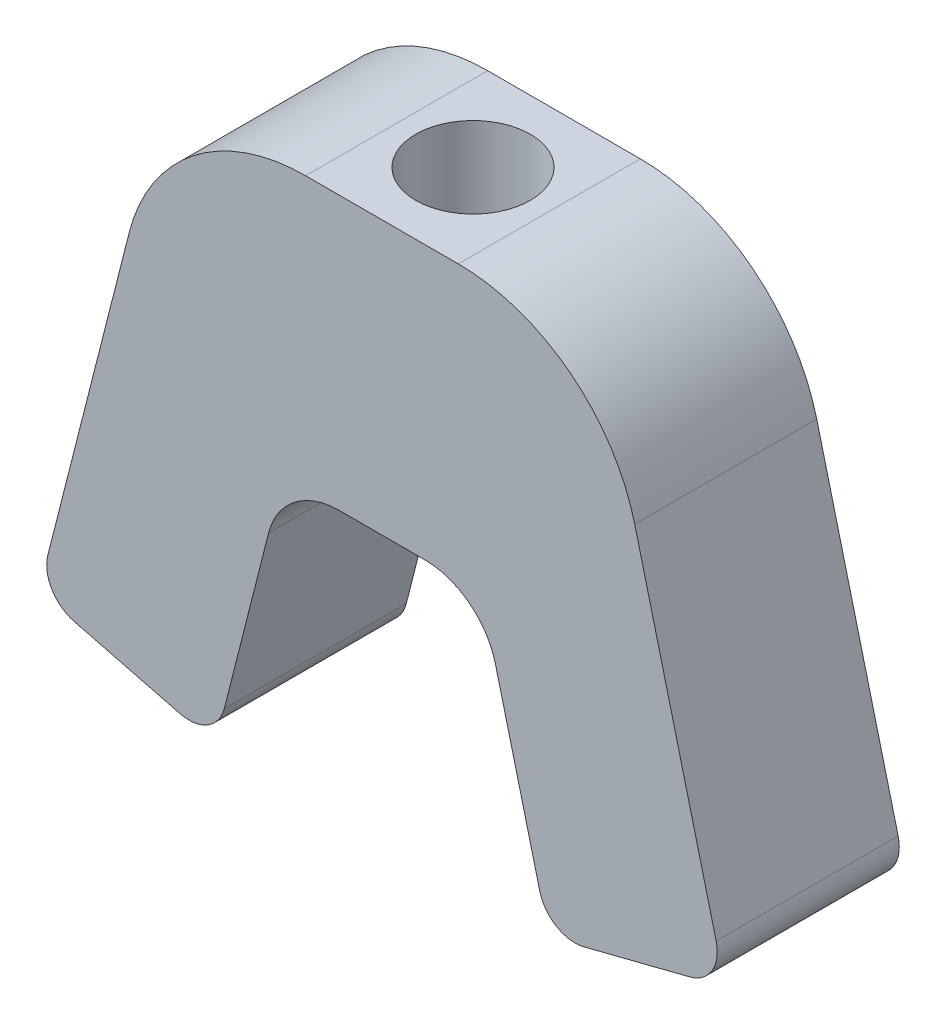
ISO-10303-21;
HEADER;
FILE_DESCRIPTION(('STEP AP214'),'2;1');
FILE_NAME('part.step','',(''),(''),'','','');
FILE_SCHEMA(('AUTOMOTIVE_DESIGN { 1 0 10303 214 1 1 1 1 }'));
ENDSEC;
DATA;
#1=APPLICATION_CONTEXT('core data for automotive mechanical design processes');
#2=APPLICATION_PROTOCOL_DEFINITION('international standard','automotive_design',2000,#1);
#3=PRODUCT_CONTEXT('',#1,'mechanical');
#4=PRODUCT('Part','Part','',(#3));
#5=PRODUCT_RELATED_PRODUCT_CATEGORY('part','',(#4));
#6=PRODUCT_DEFINITION_FORMATION('','',#4);
#7=PRODUCT_DEFINITION_CONTEXT('part definition',#1,'design');
#8=PRODUCT_DEFINITION('design','',#6,#7);
#9=PRODUCT_DEFINITION_SHAPE('','',#8);
#10=(LENGTH_UNIT() NAMED_UNIT(*) SI_UNIT(.MILLI.,.METRE.));
#11=(NAMED_UNIT(*) PLANE_ANGLE_UNIT() SI_UNIT($,.RADIAN.));
#12=(NAMED_UNIT(*) SI_UNIT($,.STERADIAN.) SOLID_ANGLE_UNIT());
#13=UNCERTAINTY_MEASURE_WITH_UNIT(LENGTH_MEASURE(1.E-05),#10,'distance_accuracy_value','');
#14=(GEOMETRIC_REPRESENTATION_CONTEXT(3) GLOBAL_UNCERTAINTY_ASSIGNED_CONTEXT((#13)) GLOBAL_UNIT_ASSIGNED_CONTEXT((#10,
#11,#12)) REPRESENTATION_CONTEXT('',''));
#15=CARTESIAN_POINT('',(0.,0.,0.));
#16=DIRECTION('',(0.,0.,1.));
#17=DIRECTION('',(1.,0.,0.));
#18=AXIS2_PLACEMENT_3D('',#15,#16,#17);
#19=CARTESIAN_POINT('',(-11.9710570127245,-34.2102619195107,6.35));
#20=DIRECTION('',(0.246334488763147,0.969184873822223,0.));
#21=DIRECTION('',(-0.969184873822223,0.246334488763147,0.));
#22=AXIS2_PLACEMENT_3D('',#19,#20,#21);
#23=PLANE('',#22);
#24=CARTESIAN_POINT('',(-8.89389503833897,-34.9923739213337,3.175));
#25=DIRECTION('',(-0.246334488763147,-0.969184873822223,0.));
#26=DIRECTION('',(0.969184873822223,-0.246334488763147,0.));
#27=AXIS2_PLACEMENT_3D('',#24,#25,#26);
#28=CIRCLE('',#27,2.);
#29=CARTESIAN_POINT('',(-10.7401922229703,-34.5231067202399,2.56592282919157));
#30=VERTEX_POINT('',#29);
#31=CARTESIAN_POINT('',(-7.04759785370763,-35.4616411224275,2.56592282919157));
#32=VERTEX_POINT('',#31);
#33=EDGE_CURVE('E222',#30,#32,#28,.T.);
#34=ORIENTED_EDGE('',*,*,#33,.F.);
#35=DIRECTION('',(0.,0.,-1.));
#36=VECTOR('',#35,1.);
#37=CARTESIAN_POINT('',(-10.7401922229703,-34.5231067202399,6.35));
#38=LINE('',#37,#36);
#39=CARTESIAN_POINT('',(-10.7401922229703,-34.5231067202399,0.));
#40=VERTEX_POINT('',#39);
#41=EDGE_CURVE('E314',#30,#40,#38,.T.);
#42=ORIENTED_EDGE('',*,*,#41,.T.);
#43=DIRECTION('',(0.969184873822223,-0.246334488763147,0.));
#44=VECTOR('',#43,1.);
#45=CARTESIAN_POINT('',(-11.9710570127245,-34.2102619195107,0.));
#46=LINE('',#45,#44);
#47=CARTESIAN_POINT('',(-7.04759785370763,-35.4616411224275,0.));
#48=VERTEX_POINT('',#47);
#49=EDGE_CURVE('E391',#40,#48,#46,.T.);
#50=ORIENTED_EDGE('',*,*,#49,.T.);
#51=DIRECTION('',(0.,0.,-1.));
#52=VECTOR('',#51,1.);
#53=CARTESIAN_POINT('',(-7.04759785370763,-35.4616411224275,6.35));
#54=LINE('',#53,#52);
#55=EDGE_CURVE('E307',#48,#32,#54,.F.);
#56=ORIENTED_EDGE('',*,*,#55,.T.);
#57=EDGE_LOOP('',(#34,#42,#50,#56));
#58=FACE_BOUND('',#57,.T.);
#59=ADVANCED_FACE('F51',(#58),#23,.F.);
#60=CARTESIAN_POINT('',(5.81673306395342,-35.7744859231567,6.35));
#61=DIRECTION('',(-0.246334488763148,0.969184873822223,0.));
#62=DIRECTION('',(-0.969184873822223,-0.246334488763148,0.));
#63=AXIS2_PLACEMENT_3D('',#60,#61,#62);
#64=PLANE('',#63);
#65=DIRECTION('',(0.,0.,-1.));
#66=VECTOR('',#65,1.);
#67=CARTESIAN_POINT('',(7.04759785370764,-35.4616411224275,6.35));
#68=LINE('',#67,#66);
#69=CARTESIAN_POINT('',(7.04759785370764,-35.4616411224275,6.35));
#70=VERTEX_POINT('',#69);
#71=CARTESIAN_POINT('',(7.04759785370764,-35.4616411224275,3.78407717080842));
#72=VERTEX_POINT('',#71);
#73=EDGE_CURVE('E332',#70,#72,#68,.T.);
#74=ORIENTED_EDGE('',*,*,#73,.T.);
#75=CARTESIAN_POINT('',(8.89389503833898,-34.9923739213337,3.175));
#76=DIRECTION('',(0.246334488763148,-0.969184873822223,0.));
#77=DIRECTION('',(0.969184873822223,0.246334488763148,0.));
#78=AXIS2_PLACEMENT_3D('',#75,#76,#77);
#79=CIRCLE('',#78,2.);
#80=CARTESIAN_POINT('',(10.7401922229703,-34.5231067202399,3.78407717080842));
#81=VERTEX_POINT('',#80);
#82=EDGE_CURVE('E229',#81,#72,#79,.T.);
#83=ORIENTED_EDGE('',*,*,#82,.F.);
#84=DIRECTION('',(0.,0.,-1.));
#85=VECTOR('',#84,1.);
#86=CARTESIAN_POINT('',(10.7401922229703,-34.5231067202399,6.35));
#87=LINE('',#86,#85);
#88=CARTESIAN_POINT('',(10.7401922229703,-34.5231067202399,6.35));
#89=VERTEX_POINT('',#88);
#90=EDGE_CURVE('E331',#81,#89,#87,.F.);
#91=ORIENTED_EDGE('',*,*,#90,.T.);
#92=DIRECTION('',(0.969184873822223,0.246334488763148,0.));
#93=VECTOR('',#92,1.);
#94=CARTESIAN_POINT('',(5.81673306395342,-35.7744859231567,6.35));
#95=LINE('',#94,#93);
#96=EDGE_CURVE('E422',#70,#89,#95,.T.);
#97=ORIENTED_EDGE('',*,*,#96,.F.);
#98=EDGE_LOOP('',(#74,#83,#91,#97));
#99=FACE_BOUND('',#98,.T.);
#100=ADVANCED_FACE('F464',(#99),#64,.F.);
#101=CARTESIAN_POINT('',(-3.47039705848443,-26.543,6.35));
#102=DIRECTION('',(0.,1.,0.));
#103=DIRECTION('',(0.,0.,1.));
#104=AXIS2_PLACEMENT_3D('',#101,#102,#103);
#105=PLANE('',#104);
#106=DIRECTION('',(0.,0.,-1.));
#107=VECTOR('',#106,1.);
#108=CARTESIAN_POINT('',(1.49522137193864,-26.543,6.35));
#109=LINE('',#108,#107);
#110=CARTESIAN_POINT('',(1.49522137193864,-26.543,0.));
#111=VERTEX_POINT('',#110);
#112=CARTESIAN_POINT('',(1.49522137193864,-26.543,1.84672553706023));
#113=VERTEX_POINT('',#112);
#114=EDGE_CURVE('E359',#111,#113,#109,.F.);
#115=ORIENTED_EDGE('',*,*,#114,.T.);
#116=CARTESIAN_POINT('',(0.,-26.543,3.175));
#117=DIRECTION('',(0.,1.,0.));
#118=DIRECTION('',(0.,0.,1.));
#119=AXIS2_PLACEMENT_3D('',#116,#117,#118);
#120=CIRCLE('',#119,2.);
#121=CARTESIAN_POINT('',(-1.49522137193864,-26.543,1.84672553706024));
#122=VERTEX_POINT('',#121);
#123=EDGE_CURVE('E286',#113,#122,#120,.T.);
#124=ORIENTED_EDGE('',*,*,#123,.T.);
#125=DIRECTION('',(0.,0.,-1.));
#126=VECTOR('',#125,1.);
#127=CARTESIAN_POINT('',(-1.49522137193864,-26.543,0.));
#128=LINE('',#127,#126);
#129=CARTESIAN_POINT('',(-1.49522137193864,-26.543,0.));
#130=VERTEX_POINT('',#129);
#131=EDGE_CURVE('E366',#122,#130,#128,.T.);
#132=ORIENTED_EDGE('',*,*,#131,.T.);
#133=DIRECTION('',(1.,0.,0.));
#134=VECTOR('',#133,1.);
#135=CARTESIAN_POINT('',(-3.47039705848443,-26.543,0.));
#136=LINE('',#135,#134);
#137=EDGE_CURVE('E408',#130,#111,#136,.T.);
#138=ORIENTED_EDGE('',*,*,#137,.T.);
#139=EDGE_LOOP('',(#115,#124,#132,#138));
#140=FACE_BOUND('',#139,.T.);
#141=ADVANCED_FACE('F510',(#140),#105,.F.);
#142=CARTESIAN_POINT('',(-5.81673306395341,-35.7744859231567,6.35));
#143=DIRECTION('',(-0.969184873822223,0.246334488763148,0.));
#144=DIRECTION('',(-0.246334488763148,-0.969184873822223,0.));
#145=AXIS2_PLACEMENT_3D('',#142,#143,#144);
#146=PLANE('',#145);
#147=DIRECTION('',(0.246334488763148,0.969184873822223,0.));
#148=VECTOR('',#147,1.);
#149=CARTESIAN_POINT('',(-5.81673306395341,-35.7744859231567,6.35));
#150=LINE('',#149,#148);
#151=CARTESIAN_POINT('',(-5.50388826322421,-34.5436211334025,6.35));
#152=VERTEX_POINT('',#151);
#153=CARTESIAN_POINT('',(-3.95695095144709,-28.4573103985416,6.35));
#154=VERTEX_POINT('',#153);
#155=EDGE_CURVE('E288',#152,#154,#150,.T.);
#156=ORIENTED_EDGE('',*,*,#155,.F.);
#157=DIRECTION('',(0.,0.,-1.));
#158=VECTOR('',#157,1.);
#159=CARTESIAN_POINT('',(-5.50388826322421,-34.5436211334025,6.35));
#160=LINE('',#159,#158);
#161=CARTESIAN_POINT('',(-5.50388826322421,-34.5436211334025,0.));
#162=VERTEX_POINT('',#161);
#163=EDGE_CURVE('E315',#152,#162,#160,.T.);
#164=ORIENTED_EDGE('',*,*,#163,.T.);
#165=DIRECTION('',(0.246334488763148,0.969184873822223,0.));
#166=VECTOR('',#165,1.);
#167=CARTESIAN_POINT('',(-5.81673306395341,-35.7744859231567,0.));
#168=LINE('',#167,#166);
#169=CARTESIAN_POINT('',(-3.95695095144709,-28.4573103985416,0.));
#170=VERTEX_POINT('',#169);
#171=EDGE_CURVE('E285',#162,#170,#168,.T.);
#172=ORIENTED_EDGE('',*,*,#171,.T.);
#173=DIRECTION('',(0.,0.,-1.));
#174=VECTOR('',#173,1.);
#175=CARTESIAN_POINT('',(-3.95695095144709,-28.4573103985416,6.35));
#176=LINE('',#175,#174);
#177=EDGE_CURVE('E356',#170,#154,#176,.F.);
#178=ORIENTED_EDGE('',*,*,#177,.T.);
#179=EDGE_LOOP('',(#156,#164,#172,#178));
#180=FACE_BOUND('',#179,.T.);
#181=ADVANCED_FACE('F438',(#180),#146,.F.);
#182=CARTESIAN_POINT('',(-1.49522137193864,-26.543,6.35));
#183=VERTEX_POINT('',#182);
#184=CARTESIAN_POINT('',(-1.49522137193864,-26.543,4.50327446293976));
#185=VERTEX_POINT('',#184);
#186=EDGE_CURVE('E363',#183,#185,#128,.T.);
#187=ORIENTED_EDGE('',*,*,#186,.T.);
#188=CARTESIAN_POINT('',(1.49522137193864,-26.543,4.50327446293977));
#189=VERTEX_POINT('',#188);
#190=EDGE_CURVE('E287',#185,#189,#120,.T.);
#191=ORIENTED_EDGE('',*,*,#190,.T.);
#192=CARTESIAN_POINT('',(1.49522137193864,-26.543,6.35));
#193=VERTEX_POINT('',#192);
#194=EDGE_CURVE('E362',#189,#193,#109,.F.);
#195=ORIENTED_EDGE('',*,*,#194,.T.);
#196=DIRECTION('',(1.,0.,0.));
#197=VECTOR('',#196,1.);
#198=CARTESIAN_POINT('',(-3.47039705848443,-26.543,6.35));
#199=LINE('',#198,#197);
#200=EDGE_CURVE('E427',#183,#193,#199,.T.);
#201=ORIENTED_EDGE('',*,*,#200,.F.);
#202=EDGE_LOOP('',(#187,#191,#195,#201));
#203=FACE_BOUND('',#202,.T.);
#204=ADVANCED_FACE('F445',(#203),#105,.F.);
#205=CARTESIAN_POINT('',(3.47039705848443,-26.543,6.35));
#206=DIRECTION('',(0.969184873822223,0.246334488763148,0.));
#207=DIRECTION('',(-0.246334488763149,0.969184873822223,0.));
#208=AXIS2_PLACEMENT_3D('',#205,#206,#207);
#209=PLANE('',#208);
#210=DIRECTION('',(0.246334488763148,-0.969184873822223,0.));
#211=VECTOR('',#210,1.);
#212=CARTESIAN_POINT('',(3.47039705848443,-26.543,0.));
#213=LINE('',#212,#211);
#214=CARTESIAN_POINT('',(3.95695095144709,-28.4573103985416,0.));
#215=VERTEX_POINT('',#214);
#216=CARTESIAN_POINT('',(5.50388826322422,-34.5436211334025,0.));
#217=VERTEX_POINT('',#216);
#218=EDGE_CURVE('E405',#215,#217,#213,.T.);
#219=ORIENTED_EDGE('',*,*,#218,.T.);
#220=DIRECTION('',(0.,0.,-1.));
#221=VECTOR('',#220,1.);
#222=CARTESIAN_POINT('',(5.50388826322422,-34.5436211334025,6.35));
#223=LINE('',#222,#221);
#224=CARTESIAN_POINT('',(5.50388826322422,-34.5436211334025,6.35));
#225=VERTEX_POINT('',#224);
#226=EDGE_CURVE('E318',#217,#225,#223,.F.);
#227=ORIENTED_EDGE('',*,*,#226,.T.);
#228=DIRECTION('',(0.246334488763148,-0.969184873822223,0.));
#229=VECTOR('',#228,1.);
#230=CARTESIAN_POINT('',(3.47039705848443,-26.543,6.35));
#231=LINE('',#230,#229);
#232=CARTESIAN_POINT('',(3.95695095144709,-28.4573103985416,6.35));
#233=VERTEX_POINT('',#232);
#234=EDGE_CURVE('E425',#233,#225,#231,.T.);
#235=ORIENTED_EDGE('',*,*,#234,.F.);
#236=DIRECTION('',(0.,0.,-1.));
#237=VECTOR('',#236,1.);
#238=CARTESIAN_POINT('',(3.95695095144709,-28.4573103985416,0.));
#239=LINE('',#238,#237);
#240=EDGE_CURVE('E367',#233,#215,#239,.T.);
#241=ORIENTED_EDGE('',*,*,#240,.T.);
#242=EDGE_LOOP('',(#219,#227,#235,#241));
#243=FACE_BOUND('',#242,.T.);
#244=ADVANCED_FACE('F453',(#243),#209,.F.);
#245=CARTESIAN_POINT('',(10.7401922229703,-34.5231067202399,0.));
#246=VERTEX_POINT('',#245);
#247=CARTESIAN_POINT('',(10.7401922229703,-34.5231067202399,2.56592282919158));
#248=VERTEX_POINT('',#247);
#249=EDGE_CURVE('E328',#246,#248,#87,.F.);
#250=ORIENTED_EDGE('',*,*,#249,.T.);
#251=CARTESIAN_POINT('',(7.04759785370764,-35.4616411224275,2.56592282919158));
#252=VERTEX_POINT('',#251);
#253=EDGE_CURVE('E79',#252,#248,#79,.T.);
#254=ORIENTED_EDGE('',*,*,#253,.F.);
#255=CARTESIAN_POINT('',(7.04759785370764,-35.4616411224275,0.));
#256=VERTEX_POINT('',#255);
#257=EDGE_CURVE('E335',#252,#256,#68,.T.);
#258=ORIENTED_EDGE('',*,*,#257,.T.);
#259=DIRECTION('',(0.969184873822223,0.246334488763148,0.));
#260=VECTOR('',#259,1.);
#261=CARTESIAN_POINT('',(5.81673306395342,-35.7744859231567,0.));
#262=LINE('',#261,#260);
#263=EDGE_CURVE('E402',#256,#246,#262,.T.);
#264=ORIENTED_EDGE('',*,*,#263,.T.);
#265=EDGE_LOOP('',(#250,#254,#258,#264));
#266=FACE_BOUND('',#265,.T.);
#267=ADVANCED_FACE('F524',(#266),#64,.F.);
#268=CARTESIAN_POINT('',(11.9710570127245,-34.2102619195107,6.35));
#269=DIRECTION('',(-0.969184873822223,-0.246334488763149,0.));
#270=DIRECTION('',(0.246334488763149,-0.969184873822223,0.));
#271=AXIS2_PLACEMENT_3D('',#268,#269,#270);
#272=PLANE('',#271);
#273=DIRECTION('',(-0.246334488763149,0.969184873822223,0.));
#274=VECTOR('',#273,1.);
#275=CARTESIAN_POINT('',(11.9710570127245,-34.2102619195107,6.35));
#276=LINE('',#275,#274);
#277=CARTESIAN_POINT('',(11.6582122119953,-32.9793971297565,6.35));
#278=VERTEX_POINT('',#277);
#279=CARTESIAN_POINT('',(8.81774184058888,-21.803775996354,6.35));
#280=VERTEX_POINT('',#279);
#281=EDGE_CURVE('E420',#278,#280,#276,.T.);
#282=ORIENTED_EDGE('',*,*,#281,.F.);
#283=DIRECTION('',(0.,0.,-1.));
#284=VECTOR('',#283,1.);
#285=CARTESIAN_POINT('',(11.6582122119953,-32.9793971297565,6.35));
#286=LINE('',#285,#284);
#287=CARTESIAN_POINT('',(11.6582122119953,-32.9793971297565,0.));
#288=VERTEX_POINT('',#287);
#289=EDGE_CURVE('E344',#278,#288,#286,.T.);
#290=ORIENTED_EDGE('',*,*,#289,.T.);
#291=DIRECTION('',(-0.246334488763149,0.969184873822223,0.));
#292=VECTOR('',#291,1.);
#293=CARTESIAN_POINT('',(11.9710570127245,-34.2102619195107,0.));
#294=LINE('',#293,#292);
#295=CARTESIAN_POINT('',(8.81774184058888,-21.803775996354,0.));
#296=VERTEX_POINT('',#295);
#297=EDGE_CURVE('E400',#288,#296,#294,.T.);
#298=ORIENTED_EDGE('',*,*,#297,.T.);
#299=DIRECTION('',(0.,0.,-1.));
#300=VECTOR('',#299,1.);
#301=CARTESIAN_POINT('',(8.81774184058888,-21.803775996354,6.35));
#302=LINE('',#301,#300);
#303=EDGE_CURVE('E370',#296,#280,#302,.F.);
#304=ORIENTED_EDGE('',*,*,#303,.T.);
#305=EDGE_LOOP('',(#282,#290,#298,#304));
#306=FACE_BOUND('',#305,.T.);
#307=ADVANCED_FACE('F471',(#306),#272,.F.);
#308=CARTESIAN_POINT('',(7.60135710818223,-17.018,6.35));
#309=DIRECTION('',(0.,-1.,0.));
#310=DIRECTION('',(0.,0.,-1.));
#311=AXIS2_PLACEMENT_3D('',#308,#309,#310);
#312=PLANE('',#311);
#313=CARTESIAN_POINT('',(0.,-17.018,3.175));
#314=DIRECTION('',(0.,1.,0.));
#315=DIRECTION('',(0.,0.,1.));
#316=AXIS2_PLACEMENT_3D('',#313,#314,#315);
#317=CIRCLE('',#316,2.);
#318=CARTESIAN_POINT('',(0.,-17.018,5.175));
#319=VERTEX_POINT('',#318);
#320=EDGE_CURVE('E257',#319,#319,#317,.T.);
#321=ORIENTED_EDGE('',*,*,#320,.F.);
#322=EDGE_LOOP('',(#321));
#323=FACE_BOUND('',#322,.T.);
#324=DIRECTION('',(-1.,0.,0.));
#325=VECTOR('',#324,1.);
#326=CARTESIAN_POINT('',(7.60135710818223,-17.018,0.));
#327=LINE('',#326,#325);
#328=CARTESIAN_POINT('',(2.66341789181776,-17.018,0.));
#329=VERTEX_POINT('',#328);
#330=CARTESIAN_POINT('',(-2.66341789181776,-17.018,0.));
#331=VERTEX_POINT('',#330);
#332=EDGE_CURVE('E397',#329,#331,#327,.T.);
#333=ORIENTED_EDGE('',*,*,#332,.T.);
#334=DIRECTION('',(0.,0.,-1.));
#335=VECTOR('',#334,1.);
#336=CARTESIAN_POINT('',(-2.66341789181776,-17.018,6.35));
#337=LINE('',#336,#335);
#338=CARTESIAN_POINT('',(-2.66341789181776,-17.018,6.35));
#339=VERTEX_POINT('',#338);
#340=EDGE_CURVE('E377',#331,#339,#337,.F.);
#341=ORIENTED_EDGE('',*,*,#340,.T.);
#342=DIRECTION('',(-1.,0.,0.));
#343=VECTOR('',#342,1.);
#344=CARTESIAN_POINT('',(7.60135710818223,-17.018,6.35));
#345=LINE('',#344,#343);
#346=CARTESIAN_POINT('',(2.66341789181776,-17.018,6.35));
#347=VERTEX_POINT('',#346);
#348=EDGE_CURVE('E417',#347,#339,#345,.T.);
#349=ORIENTED_EDGE('',*,*,#348,.F.);
#350=DIRECTION('',(0.,0.,-1.));
#351=VECTOR('',#350,1.);
#352=CARTESIAN_POINT('',(2.66341789181776,-17.018,6.35));
#353=LINE('',#352,#351);
#354=EDGE_CURVE('E379',#347,#329,#353,.T.);
#355=ORIENTED_EDGE('',*,*,#354,.T.);
#356=EDGE_LOOP('',(#333,#341,#349,#355));
#357=FACE_BOUND('',#356,.T.);
#358=ADVANCED_FACE('F481',(#323,#357),#312,.F.);
#359=CARTESIAN_POINT('',(-7.60135710818223,-17.018,6.35));
#360=DIRECTION('',(0.969184873822223,-0.246334488763148,0.));
#361=DIRECTION('',(0.246334488763148,0.969184873822223,0.));
#362=AXIS2_PLACEMENT_3D('',#359,#360,#361);
#363=PLANE('',#362);
#364=DIRECTION('',(-0.246334488763148,-0.969184873822223,0.));
#365=VECTOR('',#364,1.);
#366=CARTESIAN_POINT('',(-7.60135710818223,-17.018,0.));
#367=LINE('',#366,#365);
#368=CARTESIAN_POINT('',(-8.81774184058887,-21.803775996354,0.));
#369=VERTEX_POINT('',#368);
#370=CARTESIAN_POINT('',(-11.6582122119953,-32.9793971297565,0.));
#371=VERTEX_POINT('',#370);
#372=EDGE_CURVE('E394',#369,#371,#367,.T.);
#373=ORIENTED_EDGE('',*,*,#372,.T.);
#374=DIRECTION('',(0.,0.,-1.));
#375=VECTOR('',#374,1.);
#376=CARTESIAN_POINT('',(-11.6582122119953,-32.9793971297565,6.35));
#377=LINE('',#376,#375);
#378=CARTESIAN_POINT('',(-11.6582122119953,-32.9793971297565,6.35));
#379=VERTEX_POINT('',#378);
#380=EDGE_CURVE('E305',#371,#379,#377,.F.);
#381=ORIENTED_EDGE('',*,*,#380,.T.);
#382=DIRECTION('',(-0.246334488763148,-0.969184873822223,0.));
#383=VECTOR('',#382,1.);
#384=CARTESIAN_POINT('',(-7.60135710818223,-17.018,6.35));
#385=LINE('',#384,#383);
#386=CARTESIAN_POINT('',(-8.81774184058887,-21.803775996354,6.35));
#387=VERTEX_POINT('',#386);
#388=EDGE_CURVE('E414',#387,#379,#385,.T.);
#389=ORIENTED_EDGE('',*,*,#388,.F.);
#390=DIRECTION('',(0.,0.,-1.));
#391=VECTOR('',#390,1.);
#392=CARTESIAN_POINT('',(-8.81774184058887,-21.803775996354,6.35));
#393=LINE('',#392,#391);
#394=EDGE_CURVE('E387',#387,#369,#393,.T.);
#395=ORIENTED_EDGE('',*,*,#394,.T.);
#396=EDGE_LOOP('',(#373,#381,#389,#395));
#397=FACE_BOUND('',#396,.T.);
#398=ADVANCED_FACE('F490',(#397),#363,.F.);
#399=CARTESIAN_POINT('',(-10.7401922229703,-34.5231067202399,6.35));
#400=VERTEX_POINT('',#399);
#401=CARTESIAN_POINT('',(-10.7401922229703,-34.5231067202399,3.78407717080843));
#402=VERTEX_POINT('',#401);
#403=EDGE_CURVE('E311',#400,#402,#38,.T.);
#404=ORIENTED_EDGE('',*,*,#403,.T.);
#405=CARTESIAN_POINT('',(-7.04759785370763,-35.4616411224275,3.78407717080843));
#406=VERTEX_POINT('',#405);
#407=EDGE_CURVE('E71',#406,#402,#28,.T.);
#408=ORIENTED_EDGE('',*,*,#407,.F.);
#409=CARTESIAN_POINT('',(-7.04759785370763,-35.4616411224275,6.35));
#410=VERTEX_POINT('',#409);
#411=EDGE_CURVE('E310',#406,#410,#54,.F.);
#412=ORIENTED_EDGE('',*,*,#411,.T.);
#413=DIRECTION('',(0.969184873822223,-0.246334488763147,0.));
#414=VECTOR('',#413,1.);
#415=CARTESIAN_POINT('',(-11.9710570127245,-34.2102619195107,6.35));
#416=LINE('',#415,#414);
#417=EDGE_CURVE('E390',#400,#410,#416,.T.);
#418=ORIENTED_EDGE('',*,*,#417,.F.);
#419=EDGE_LOOP('',(#404,#408,#412,#418));
#420=FACE_BOUND('',#419,.T.);
#421=ADVANCED_FACE('F500',(#420),#23,.F.);
#422=CARTESIAN_POINT('',(0.,0.,6.35));
#423=DIRECTION('',(0.,0.,-1.));
#424=DIRECTION('',(-1.,0.,0.));
#425=AXIS2_PLACEMENT_3D('',#422,#423,#424);
#426=PLANE('',#425);
#427=ORIENTED_EDGE('',*,*,#96,.T.);
#428=CARTESIAN_POINT('',(10.4273474222411,-33.2922419304857,6.35));
#429=DIRECTION('',(0.,0.,-1.));
#430=DIRECTION('',(-1.,0.,0.));
#431=AXIS2_PLACEMENT_3D('',#428,#429,#430);
#432=CIRCLE('',#431,1.27);
#433=EDGE_CURVE('E320',#89,#278,#432,.F.);
#434=ORIENTED_EDGE('',*,*,#433,.T.);
#435=ORIENTED_EDGE('',*,*,#281,.T.);
#436=CARTESIAN_POINT('',(2.66341789181776,-23.368,6.35));
#437=DIRECTION('',(0.,0.,-1.));
#438=DIRECTION('',(-1.,0.,0.));
#439=AXIS2_PLACEMENT_3D('',#436,#437,#438);
#440=CIRCLE('',#439,6.35);
#441=EDGE_CURVE('E375',#280,#347,#440,.F.);
#442=ORIENTED_EDGE('',*,*,#441,.T.);
#443=ORIENTED_EDGE('',*,*,#348,.T.);
#444=CARTESIAN_POINT('',(-2.66341789181776,-23.368,6.35));
#445=DIRECTION('',(0.,0.,-1.));
#446=DIRECTION('',(-1.,0.,0.));
#447=AXIS2_PLACEMENT_3D('',#444,#445,#446);
#448=CIRCLE('',#447,6.35);
#449=EDGE_CURVE('E373',#339,#387,#448,.F.);
#450=ORIENTED_EDGE('',*,*,#449,.T.);
#451=ORIENTED_EDGE('',*,*,#388,.T.);
#452=CARTESIAN_POINT('',(-10.4273474222411,-33.2922419304857,6.35));
#453=DIRECTION('',(0.,0.,-1.));
#454=DIRECTION('',(-1.,0.,0.));
#455=AXIS2_PLACEMENT_3D('',#452,#453,#454);
#456=CIRCLE('',#455,1.27);
#457=EDGE_CURVE('E326',#379,#400,#456,.F.);
#458=ORIENTED_EDGE('',*,*,#457,.T.);
#459=ORIENTED_EDGE('',*,*,#417,.T.);
#460=CARTESIAN_POINT('',(-6.73475305297844,-34.2307763326733,6.35));
#461=DIRECTION('',(0.,0.,-1.));
#462=DIRECTION('',(-1.,0.,0.));
#463=AXIS2_PLACEMENT_3D('',#460,#461,#462);
#464=CIRCLE('',#463,1.27);
#465=EDGE_CURVE('E324',#410,#152,#464,.F.);
#466=ORIENTED_EDGE('',*,*,#465,.T.);
#467=ORIENTED_EDGE('',*,*,#155,.T.);
#468=CARTESIAN_POINT('',(-1.49522137193864,-29.083,6.35));
#469=DIRECTION('',(0.,0.,-1.));
#470=DIRECTION('',(-1.,0.,0.));
#471=AXIS2_PLACEMENT_3D('',#468,#469,#470);
#472=CIRCLE('',#471,2.54);
#473=EDGE_CURVE('E347',#154,#183,#472,.T.);
#474=ORIENTED_EDGE('',*,*,#473,.T.);
#475=ORIENTED_EDGE('',*,*,#200,.T.);
#476=CARTESIAN_POINT('',(1.49522137193864,-29.083,6.35));
#477=DIRECTION('',(0.,0.,-1.));
#478=DIRECTION('',(-1.,0.,0.));
#479=AXIS2_PLACEMENT_3D('',#476,#477,#478);
#480=CIRCLE('',#479,2.54);
#481=EDGE_CURVE('E352',#193,#233,#480,.T.);
#482=ORIENTED_EDGE('',*,*,#481,.T.);
#483=ORIENTED_EDGE('',*,*,#234,.T.);
#484=CARTESIAN_POINT('',(6.73475305297845,-34.2307763326733,6.35));
#485=DIRECTION('',(0.,0.,-1.));
#486=DIRECTION('',(-1.,0.,0.));
#487=AXIS2_PLACEMENT_3D('',#484,#485,#486);
#488=CIRCLE('',#487,1.27);
#489=EDGE_CURVE('E322',#225,#70,#488,.F.);
#490=ORIENTED_EDGE('',*,*,#489,.T.);
#491=EDGE_LOOP('',(#427,#434,#435,#442,#443,#450,#451,#458,#459,#466,#467,#474,#475,#482,#483,#490));
#492=FACE_BOUND('',#491,.T.);
#493=ADVANCED_FACE('F295',(#492),#426,.F.);
#494=CARTESIAN_POINT('',(0.,0.,0.));
#495=DIRECTION('',(0.,0.,-1.));
#496=DIRECTION('',(-1.,0.,0.));
#497=AXIS2_PLACEMENT_3D('',#494,#495,#496);
#498=PLANE('',#497);
#499=ORIENTED_EDGE('',*,*,#297,.F.);
#500=CARTESIAN_POINT('',(10.4273474222411,-33.2922419304857,0.));
#501=DIRECTION('',(0.,0.,-1.));
#502=DIRECTION('',(-1.,0.,0.));
#503=AXIS2_PLACEMENT_3D('',#500,#501,#502);
#504=CIRCLE('',#503,1.27);
#505=EDGE_CURVE('E336',#288,#246,#504,.T.);
#506=ORIENTED_EDGE('',*,*,#505,.T.);
#507=ORIENTED_EDGE('',*,*,#263,.F.);
#508=CARTESIAN_POINT('',(6.73475305297845,-34.2307763326733,0.));
#509=DIRECTION('',(0.,0.,-1.));
#510=DIRECTION('',(-1.,0.,0.));
#511=AXIS2_PLACEMENT_3D('',#508,#509,#510);
#512=CIRCLE('',#511,1.27);
#513=EDGE_CURVE('E338',#256,#217,#512,.T.);
#514=ORIENTED_EDGE('',*,*,#513,.T.);
#515=ORIENTED_EDGE('',*,*,#218,.F.);
#516=CARTESIAN_POINT('',(1.49522137193864,-29.083,0.));
#517=DIRECTION('',(0.,0.,-1.));
#518=DIRECTION('',(-1.,0.,0.));
#519=AXIS2_PLACEMENT_3D('',#516,#517,#518);
#520=CIRCLE('',#519,2.54);
#521=EDGE_CURVE('E354',#215,#111,#520,.F.);
#522=ORIENTED_EDGE('',*,*,#521,.T.);
#523=ORIENTED_EDGE('',*,*,#137,.F.);
#524=CARTESIAN_POINT('',(-1.49522137193864,-29.083,0.));
#525=DIRECTION('',(0.,0.,-1.));
#526=DIRECTION('',(-1.,0.,0.));
#527=AXIS2_PLACEMENT_3D('',#524,#525,#526);
#528=CIRCLE('',#527,2.54);
#529=EDGE_CURVE('E349',#130,#170,#528,.F.);
#530=ORIENTED_EDGE('',*,*,#529,.T.);
#531=ORIENTED_EDGE('',*,*,#171,.F.);
#532=CARTESIAN_POINT('',(-6.73475305297844,-34.2307763326733,0.));
#533=DIRECTION('',(0.,0.,-1.));
#534=DIRECTION('',(-1.,0.,0.));
#535=AXIS2_PLACEMENT_3D('',#532,#533,#534);
#536=CIRCLE('',#535,1.27);
#537=EDGE_CURVE('E340',#162,#48,#536,.T.);
#538=ORIENTED_EDGE('',*,*,#537,.T.);
#539=ORIENTED_EDGE('',*,*,#49,.F.);
#540=CARTESIAN_POINT('',(-10.4273474222411,-33.2922419304857,0.));
#541=DIRECTION('',(0.,0.,-1.));
#542=DIRECTION('',(-1.,0.,0.));
#543=AXIS2_PLACEMENT_3D('',#540,#541,#542);
#544=CIRCLE('',#543,1.27);
#545=EDGE_CURVE('E342',#40,#371,#544,.T.);
#546=ORIENTED_EDGE('',*,*,#545,.T.);
#547=ORIENTED_EDGE('',*,*,#372,.F.);
#548=CARTESIAN_POINT('',(-2.66341789181776,-23.368,0.));
#549=DIRECTION('',(0.,0.,-1.));
#550=DIRECTION('',(-1.,0.,0.));
#551=AXIS2_PLACEMENT_3D('',#548,#549,#550);
#552=CIRCLE('',#551,6.35);
#553=EDGE_CURVE('E382',#369,#331,#552,.T.);
#554=ORIENTED_EDGE('',*,*,#553,.T.);
#555=ORIENTED_EDGE('',*,*,#332,.F.);
#556=CARTESIAN_POINT('',(2.66341789181776,-23.368,0.));
#557=DIRECTION('',(0.,0.,-1.));
#558=DIRECTION('',(-1.,0.,0.));
#559=AXIS2_PLACEMENT_3D('',#556,#557,#558);
#560=CIRCLE('',#559,6.35);
#561=EDGE_CURVE('E384',#329,#296,#560,.T.);
#562=ORIENTED_EDGE('',*,*,#561,.T.);
#563=EDGE_LOOP('',(#499,#506,#507,#514,#515,#522,#523,#530,#531,#538,#539,#546,#547,#554,#555,#562));
#564=FACE_BOUND('',#563,.T.);
#565=ADVANCED_FACE('F506',(#564),#498,.T.);
#566=CARTESIAN_POINT('',(-2.66341789181776,-23.368,6.35));
#567=DIRECTION('',(0.,0.,-1.));
#568=DIRECTION('',(-1.,0.,0.));
#569=AXIS2_PLACEMENT_3D('',#566,#567,#568);
#570=CYLINDRICAL_SURFACE('',#569,6.35);
#571=ORIENTED_EDGE('',*,*,#449,.F.);
#572=ORIENTED_EDGE('',*,*,#340,.F.);
#573=ORIENTED_EDGE('',*,*,#553,.F.);
#574=ORIENTED_EDGE('',*,*,#394,.F.);
#575=EDGE_LOOP('',(#571,#572,#573,#574));
#576=FACE_BOUND('',#575,.T.);
#577=ADVANCED_FACE('F485',(#576),#570,.T.);
#578=CARTESIAN_POINT('',(2.66341789181776,-23.368,6.35));
#579=DIRECTION('',(0.,0.,-1.));
#580=DIRECTION('',(-1.,0.,0.));
#581=AXIS2_PLACEMENT_3D('',#578,#579,#580);
#582=CYLINDRICAL_SURFACE('',#581,6.35);
#583=ORIENTED_EDGE('',*,*,#441,.F.);
#584=ORIENTED_EDGE('',*,*,#303,.F.);
#585=ORIENTED_EDGE('',*,*,#561,.F.);
#586=ORIENTED_EDGE('',*,*,#354,.F.);
#587=EDGE_LOOP('',(#583,#584,#585,#586));
#588=FACE_BOUND('',#587,.T.);
#589=ADVANCED_FACE('F477',(#588),#582,.T.);
#590=CARTESIAN_POINT('',(1.49522137193864,-29.083,6.35));
#591=DIRECTION('',(0.,0.,1.));
#592=DIRECTION('',(1.,0.,0.));
#593=AXIS2_PLACEMENT_3D('',#590,#591,#592);
#594=CYLINDRICAL_SURFACE('',#593,2.54);
#595=ORIENTED_EDGE('',*,*,#194,.F.);
#596=CARTESIAN_POINT('',(1.49522137193864,-26.543,4.50327446293977));
#597=CARTESIAN_POINT('',(1.53242381425069,-26.5430021805854,4.46139695114175));
#598=CARTESIAN_POINT('',(1.56784018270167,-26.5438168240876,4.4179832348359));
#599=CARTESIAN_POINT('',(1.63488500241983,-26.5466205304835,4.3283788804823));
#600=CARTESIAN_POINT('',(1.66651467233901,-26.5486092143138,4.28218914305263));
#601=CARTESIAN_POINT('',(1.75537391958838,-26.5556571986567,4.13995376504521));
#602=CARTESIAN_POINT('',(1.80665065367799,-26.5618002789204,4.04015514834189));
#603=CARTESIAN_POINT('',(1.89180912586146,-26.5737810632953,3.83345741844727));
#604=CARTESIAN_POINT('',(1.92569400369824,-26.5796188223548,3.72655959081105));
#605=CARTESIAN_POINT('',(1.97515123141662,-26.5886249517798,3.50854293115938));
#606=CARTESIAN_POINT('',(1.9907359148012,-26.5917951195723,3.39742699415606));
#607=CARTESIAN_POINT('',(2.00311649503822,-26.5942883115305,3.17425508087731));
#608=CARTESIAN_POINT('',(1.99993685817027,-26.5936163453843,3.06220051884491));
#609=CARTESIAN_POINT('',(1.97493975987825,-26.5886812214993,2.84018818174465));
#610=CARTESIAN_POINT('',(1.95310795296213,-26.5844152996635,2.73023208718347));
#611=CARTESIAN_POINT('',(1.89172668219348,-26.5739490610843,2.51647865475371));
#612=CARTESIAN_POINT('',(1.85232085819777,-26.5677645480951,2.41263896202362));
#613=CARTESIAN_POINT('',(1.75690418425749,-26.5560624553156,2.21297862293757));
#614=CARTESIAN_POINT('',(1.70092295693832,-26.5505437102583,2.11714405871746));
#615=CARTESIAN_POINT('',(1.6154859149768,-26.5457538316309,1.99530640103351));
#616=CARTESIAN_POINT('',(1.59261723213145,-26.544757022214,1.96461242863342));
#617=CARTESIAN_POINT('',(1.54518144383318,-26.543380608947,1.90461763431096));
#618=CARTESIAN_POINT('',(1.52061660426882,-26.5430001976706,1.87531503875879));
#619=CARTESIAN_POINT('',(1.49522137193864,-26.543,1.84672553706023));
#620=B_SPLINE_CURVE_WITH_KNOTS('',3,(#596,#597,#598,#599,#600,#601,#602,#603,#604,#605,#606,
#607,#608,#609,#610,#611,#612,#613,#614,#615,#616,#617,#618,#619),.UNSPECIFIED.,.F.,.F.,(4,2,2,
2,2,2,2,2,2,2,2,4),(0.,0.16792321433462,0.335792240774704,0.67118683150517,1.00652085230574,
1.34162874320082,1.67629979278172,2.01122847175846,2.34346842720726,2.6751181696072,
2.78993515104549,2.9046016105795),.UNSPECIFIED.);
#621=EDGE_CURVE('E298',#189,#113,#620,.T.);
#622=ORIENTED_EDGE('',*,*,#621,.T.);
#623=ORIENTED_EDGE('',*,*,#114,.F.);
#624=ORIENTED_EDGE('',*,*,#521,.F.);
#625=ORIENTED_EDGE('',*,*,#240,.F.);
#626=ORIENTED_EDGE('',*,*,#481,.F.);
#627=EDGE_LOOP('',(#595,#622,#623,#624,#625,#626));
#628=FACE_BOUND('',#627,.T.);
#629=ADVANCED_FACE('F273',(#628),#594,.F.);
#630=CARTESIAN_POINT('',(-1.49522137193864,-29.083,6.35));
#631=DIRECTION('',(0.,0.,1.));
#632=DIRECTION('',(1.,0.,0.));
#633=AXIS2_PLACEMENT_3D('',#630,#631,#632);
#634=CYLINDRICAL_SURFACE('',#633,2.54);
#635=ORIENTED_EDGE('',*,*,#131,.F.);
#636=CARTESIAN_POINT('',(-1.49522137193864,-26.543,1.84672553706024));
#637=CARTESIAN_POINT('',(-1.53242381425069,-26.5430021805854,1.88860304885825));
#638=CARTESIAN_POINT('',(-1.56784018270167,-26.5438168240876,1.93201676516411));
#639=CARTESIAN_POINT('',(-1.63488500241983,-26.5466205304835,2.0216211195177));
#640=CARTESIAN_POINT('',(-1.66651467233901,-26.5486092143138,2.06781085694737));
#641=CARTESIAN_POINT('',(-1.75537391958837,-26.5556571986567,2.21004623495479));
#642=CARTESIAN_POINT('',(-1.80665065367799,-26.5618002789204,2.30984485165811));
#643=CARTESIAN_POINT('',(-1.89180912586145,-26.5737810632953,2.51654258155273));
#644=CARTESIAN_POINT('',(-1.92569400369824,-26.5796188223548,2.62344040918895));
#645=CARTESIAN_POINT('',(-1.97515123141662,-26.5886249517798,2.84145706884062));
#646=CARTESIAN_POINT('',(-1.99073591480119,-26.5917951195723,2.95257300584394));
#647=CARTESIAN_POINT('',(-2.00311649503821,-26.5942883115305,3.1757449191227));
#648=CARTESIAN_POINT('',(-1.99993685817026,-26.5936163453843,3.28779948115509));
#649=CARTESIAN_POINT('',(-1.97493975987825,-26.5886812214993,3.50981181825535));
#650=CARTESIAN_POINT('',(-1.95310795296213,-26.5844152996635,3.61976791281654));
#651=CARTESIAN_POINT('',(-1.89172668219347,-26.5739490610843,3.83352134524629));
#652=CARTESIAN_POINT('',(-1.85232085819776,-26.5677645480951,3.93736103797638));
#653=CARTESIAN_POINT('',(-1.75690418425748,-26.5560624553156,4.13702137706243));
#654=CARTESIAN_POINT('',(-1.70092295693831,-26.5505437102583,4.23285594128254));
#655=CARTESIAN_POINT('',(-1.61548591497679,-26.5457538316309,4.35469359896649));
#656=CARTESIAN_POINT('',(-1.59261723213144,-26.544757022214,4.38538757136658));
#657=CARTESIAN_POINT('',(-1.54518144383318,-26.543380608947,4.44538236568904));
#658=CARTESIAN_POINT('',(-1.52061660426882,-26.5430001976706,4.4746849612412));
#659=CARTESIAN_POINT('',(-1.49522137193864,-26.543,4.50327446293976));
#660=B_SPLINE_CURVE_WITH_KNOTS('',3,(#636,#637,#638,#639,#640,#641,#642,#643,#644,#645,#646,
#647,#648,#649,#650,#651,#652,#653,#654,#655,#656,#657,#658,#659),.UNSPECIFIED.,.F.,.F.,(4,2,2,
2,2,2,2,2,2,2,2,4),(0.,0.167923214334619,0.335792240774704,0.671186831505169,1.00652085230574,
1.34162874320081,1.67629979278172,2.01122847175846,2.34346842720726,2.6751181696072,
2.78993515104548,2.90460161057949),.UNSPECIFIED.);
#661=EDGE_CURVE('E278',#122,#185,#660,.T.);
#662=ORIENTED_EDGE('',*,*,#661,.T.);
#663=ORIENTED_EDGE('',*,*,#186,.F.);
#664=ORIENTED_EDGE('',*,*,#473,.F.);
#665=ORIENTED_EDGE('',*,*,#177,.F.);
#666=ORIENTED_EDGE('',*,*,#529,.F.);
#667=EDGE_LOOP('',(#635,#662,#663,#664,#665,#666));
#668=FACE_BOUND('',#667,.T.);
#669=ADVANCED_FACE('F268',(#668),#634,.F.);
#670=CARTESIAN_POINT('',(10.4273474222411,-33.2922419304857,6.35));
#671=DIRECTION('',(0.,0.,-1.));
#672=DIRECTION('',(-1.,0.,0.));
#673=AXIS2_PLACEMENT_3D('',#670,#671,#672);
#674=CYLINDRICAL_SURFACE('',#673,1.27);
#675=CARTESIAN_POINT('',(10.7401922229703,-34.5231067202399,2.56592282919158));
#676=CARTESIAN_POINT('',(10.7562822375015,-34.5189941744424,2.61784762203152));
#677=CARTESIAN_POINT('',(10.7702348802506,-34.5151337692273,2.67045246461741));
#678=CARTESIAN_POINT('',(10.793879420625,-34.5082687131085,2.77666733875521));
#679=CARTESIAN_POINT('',(10.8035712398402,-34.5052640779535,2.83027738878658));
#680=CARTESIAN_POINT('',(10.8185231183482,-34.5005207187073,2.93683155104609));
#681=CARTESIAN_POINT('',(10.8238854164998,-34.4987529308395,2.98976005687097));
#682=CARTESIAN_POINT('',(10.8305741014294,-34.4965350424258,3.09589446613825));
#683=CARTESIAN_POINT('',(10.8319009465149,-34.4960847922469,3.1491003373926));
#684=CARTESIAN_POINT('',(10.8305794732871,-34.4965275076182,3.25101656450661));
#685=CARTESIAN_POINT('',(10.8282533415292,-34.4973116189331,3.29973190163766));
#686=CARTESIAN_POINT('',(10.8202103707811,-34.4999571443253,3.39685220154406));
#687=CARTESIAN_POINT('',(10.8144935845741,-34.5018185416323,3.44525716913915));
#688=CARTESIAN_POINT('',(10.7994929491842,-34.5065209842217,3.54260102755588));
#689=CARTESIAN_POINT('',(10.7901304383515,-34.5093834802306,3.59152677448394));
#690=CARTESIAN_POINT('',(10.7678390358879,-34.5157979850014,3.68851693210103));
#691=CARTESIAN_POINT('',(10.7549098516956,-34.5193500503191,3.73658127178734));
#692=CARTESIAN_POINT('',(10.7401922229703,-34.5231067202399,3.78407717080842));
#693=B_SPLINE_CURVE_WITH_KNOTS('',3,(#675,#676,#677,#678,#679,#680,#681,#682,#683,#684,#685,
#686,#687,#688,#689,#690,#691,#692),.UNSPECIFIED.,.F.,.F.,(4,2,2,2,2,2,2,2,4),(0.,
0.163499357334246,0.327001723349679,0.486519833575757,0.646019826603365,0.792222326662486,
0.93842255080731,1.08796960330309,1.23752892625525),.UNSPECIFIED.);
#694=EDGE_CURVE('E65',#248,#81,#693,.T.);
#695=ORIENTED_EDGE('',*,*,#694,.F.);
#696=ORIENTED_EDGE('',*,*,#249,.F.);
#697=ORIENTED_EDGE('',*,*,#505,.F.);
#698=ORIENTED_EDGE('',*,*,#289,.F.);
#699=ORIENTED_EDGE('',*,*,#433,.F.);
#700=ORIENTED_EDGE('',*,*,#90,.F.);
#701=EDGE_LOOP('',(#695,#696,#697,#698,#699,#700));
#702=FACE_BOUND('',#701,.T.);
#703=ADVANCED_FACE('F263',(#702),#674,.T.);
#704=CARTESIAN_POINT('',(6.73475305297845,-34.2307763326733,6.35));
#705=DIRECTION('',(0.,0.,-1.));
#706=DIRECTION('',(-1.,0.,0.));
#707=AXIS2_PLACEMENT_3D('',#704,#705,#706);
#708=CYLINDRICAL_SURFACE('',#707,1.27);
#709=CARTESIAN_POINT('',(7.04759785370764,-35.4616411224275,3.78407717080842));
#710=CARTESIAN_POINT('',(7.03149685675922,-35.4657104587144,3.73215237796848));
#711=CARTESIAN_POINT('',(7.01739423117614,-35.4689807675338,3.67954753538259));
#712=CARTESIAN_POINT('',(6.99334124714145,-35.4742388322023,3.57333266124479));
#713=CARTESIAN_POINT('',(6.98339096510378,-35.476226564449,3.51972261121341));
#714=CARTESIAN_POINT('',(6.96798877301851,-35.4791981981452,3.4131684489539));
#715=CARTESIAN_POINT('',(6.96243315437431,-35.4802053807964,3.36023994312902));
#716=CARTESIAN_POINT('',(6.95549720375263,-35.4814504205853,3.25410553386174));
#717=CARTESIAN_POINT('',(6.95411639764049,-35.4816883650858,3.2008996626074));
#718=CARTESIAN_POINT('',(6.95548888605576,-35.4814463652062,3.09898343549339));
#719=CARTESIAN_POINT('',(6.9579071185093,-35.481024617284,3.05026809836233));
#720=CARTESIAN_POINT('',(6.96623718821499,-35.4795086615609,2.95314779845594));
#721=CARTESIAN_POINT('',(6.97214897108209,-35.4784144642282,2.90474283086085));
#722=CARTESIAN_POINT('',(6.9875744656629,-35.4753835987834,2.80739897244412));
#723=CARTESIAN_POINT('',(6.99716753499152,-35.473428218168,2.75847322551607));
#724=CARTESIAN_POINT('',(7.01981646721744,-35.4684203878719,2.66148306789898));
#725=CARTESIAN_POINT('',(7.03287261417516,-35.4653678481889,2.61341872821266));
#726=CARTESIAN_POINT('',(7.04759785370764,-35.4616411224275,2.56592282919158));
#727=B_SPLINE_CURVE_WITH_KNOTS('',3,(#709,#710,#711,#712,#713,#714,#715,#716,#717,#718,#719,
#720,#721,#722,#723,#724,#725,#726),.UNSPECIFIED.,.F.,.F.,(4,2,2,2,2,2,2,2,4),(0.,
0.163499357334246,0.327001723349679,0.486519833575758,0.646019826603366,0.792222326662484,
0.938422550807304,1.08796960330308,1.23752892625523),.UNSPECIFIED.);
#728=EDGE_CURVE('E251',#72,#252,#727,.T.);
#729=ORIENTED_EDGE('',*,*,#728,.F.);
#730=ORIENTED_EDGE('',*,*,#73,.F.);
#731=ORIENTED_EDGE('',*,*,#489,.F.);
#732=ORIENTED_EDGE('',*,*,#226,.F.);
#733=ORIENTED_EDGE('',*,*,#513,.F.);
#734=ORIENTED_EDGE('',*,*,#257,.F.);
#735=EDGE_LOOP('',(#729,#730,#731,#732,#733,#734));
#736=FACE_BOUND('',#735,.T.);
#737=ADVANCED_FACE('F260',(#736),#708,.T.);
#738=CARTESIAN_POINT('',(-6.73475305297844,-34.2307763326733,6.35));
#739=DIRECTION('',(0.,0.,-1.));
#740=DIRECTION('',(-1.,0.,0.));
#741=AXIS2_PLACEMENT_3D('',#738,#739,#740);
#742=CYLINDRICAL_SURFACE('',#741,1.27);
#743=CARTESIAN_POINT('',(-7.04759785370763,-35.4616411224275,2.56592282919157));
#744=CARTESIAN_POINT('',(-7.03149685675921,-35.4657104587144,2.61784762203151));
#745=CARTESIAN_POINT('',(-7.01739423117613,-35.4689807675338,2.6704524646174));
#746=CARTESIAN_POINT('',(-6.99334124714145,-35.4742388322023,2.7766673387552));
#747=CARTESIAN_POINT('',(-6.98339096510377,-35.476226564449,2.83027738878658));
#748=CARTESIAN_POINT('',(-6.9679887730185,-35.4791981981452,2.93683155104608));
#749=CARTESIAN_POINT('',(-6.96243315437429,-35.4802053807964,2.98976005687097));
#750=CARTESIAN_POINT('',(-6.95549720375262,-35.4814504205853,3.09589446613824));
#751=CARTESIAN_POINT('',(-6.95411639764048,-35.4816883650858,3.14910033739259));
#752=CARTESIAN_POINT('',(-6.95548888605574,-35.4814463652062,3.2510165645066));
#753=CARTESIAN_POINT('',(-6.95790711850929,-35.481024617284,3.29973190163766));
#754=CARTESIAN_POINT('',(-6.96623718821498,-35.4795086615609,3.39685220154406));
#755=CARTESIAN_POINT('',(-6.97214897108208,-35.4784144642282,3.44525716913914));
#756=CARTESIAN_POINT('',(-6.98757446566289,-35.4753835987834,3.54260102755588));
#757=CARTESIAN_POINT('',(-6.9971675349915,-35.473428218168,3.59152677448393));
#758=CARTESIAN_POINT('',(-7.01981646721743,-35.4684203878719,3.68851693210103));
#759=CARTESIAN_POINT('',(-7.03287261417515,-35.4653678481889,3.73658127178735));
#760=CARTESIAN_POINT('',(-7.04759785370763,-35.4616411224275,3.78407717080843));
#761=B_SPLINE_CURVE_WITH_KNOTS('',3,(#743,#744,#745,#746,#747,#748,#749,#750,#751,#752,#753,
#754,#755,#756,#757,#758,#759,#760),.UNSPECIFIED.,.F.,.F.,(4,2,2,2,2,2,2,2,4),(0.,
0.163499357334246,0.327001723349679,0.486519833575757,0.646019826603365,0.792222326662489,
0.938422550807315,1.0879696033031,1.23752892625526),.UNSPECIFIED.);
#762=EDGE_CURVE('E219',#32,#406,#761,.T.);
#763=ORIENTED_EDGE('',*,*,#762,.F.);
#764=ORIENTED_EDGE('',*,*,#55,.F.);
#765=ORIENTED_EDGE('',*,*,#537,.F.);
#766=ORIENTED_EDGE('',*,*,#163,.F.);
#767=ORIENTED_EDGE('',*,*,#465,.F.);
#768=ORIENTED_EDGE('',*,*,#411,.F.);
#769=EDGE_LOOP('',(#763,#764,#765,#766,#767,#768));
#770=FACE_BOUND('',#769,.T.);
#771=ADVANCED_FACE('F231',(#770),#742,.T.);
#772=CARTESIAN_POINT('',(-10.4273474222411,-33.2922419304857,6.35));
#773=DIRECTION('',(0.,0.,-1.));
#774=DIRECTION('',(-1.,0.,0.));
#775=AXIS2_PLACEMENT_3D('',#772,#773,#774);
#776=CYLINDRICAL_SURFACE('',#775,1.27);
#777=CARTESIAN_POINT('',(-10.7401922229703,-34.5231067202399,3.78407717080843));
#778=CARTESIAN_POINT('',(-10.7562822375015,-34.5189941744424,3.73215237796849));
#779=CARTESIAN_POINT('',(-10.7702348802506,-34.5151337692274,3.6795475353826));
#780=CARTESIAN_POINT('',(-10.793879420625,-34.5082687131085,3.5733326612448));
#781=CARTESIAN_POINT('',(-10.8035712398402,-34.5052640779535,3.51972261121343));
#782=CARTESIAN_POINT('',(-10.8185231183482,-34.5005207187073,3.41316844895392));
#783=CARTESIAN_POINT('',(-10.8238854164998,-34.4987529308395,3.36023994312904));
#784=CARTESIAN_POINT('',(-10.8305741014293,-34.4965350424258,3.25410553386176));
#785=CARTESIAN_POINT('',(-10.8319009465149,-34.4960847922469,3.20089966260741));
#786=CARTESIAN_POINT('',(-10.8305794732871,-34.4965275076182,3.0989834354934));
#787=CARTESIAN_POINT('',(-10.8282533415292,-34.4973116189331,3.05026809836234));
#788=CARTESIAN_POINT('',(-10.8202103707811,-34.4999571443254,2.95314779845594));
#789=CARTESIAN_POINT('',(-10.8144935845741,-34.5018185416323,2.90474283086085));
#790=CARTESIAN_POINT('',(-10.7994929491842,-34.5065209842217,2.80739897244412));
#791=CARTESIAN_POINT('',(-10.7901304383515,-34.5093834802306,2.75847322551606));
#792=CARTESIAN_POINT('',(-10.7678390358879,-34.5157979850015,2.66148306789896));
#793=CARTESIAN_POINT('',(-10.7549098516956,-34.5193500503191,2.61341872821265));
#794=CARTESIAN_POINT('',(-10.7401922229703,-34.5231067202399,2.56592282919156));
#795=B_SPLINE_CURVE_WITH_KNOTS('',3,(#777,#778,#779,#780,#781,#782,#783,#784,#785,#786,#787,
#788,#789,#790,#791,#792,#793,#794),.UNSPECIFIED.,.F.,.F.,(4,2,2,2,2,2,2,2,4),(0.,
0.163499357334246,0.32700172334968,0.486519833575758,0.646019826603366,0.792222326662492,
0.938422550807321,1.08796960330311,1.23752892625527),.UNSPECIFIED.);
#796=EDGE_CURVE('E11',#402,#30,#795,.T.);
#797=ORIENTED_EDGE('',*,*,#796,.F.);
#798=ORIENTED_EDGE('',*,*,#403,.F.);
#799=ORIENTED_EDGE('',*,*,#457,.F.);
#800=ORIENTED_EDGE('',*,*,#380,.F.);
#801=ORIENTED_EDGE('',*,*,#545,.F.);
#802=ORIENTED_EDGE('',*,*,#41,.F.);
#803=EDGE_LOOP('',(#797,#798,#799,#800,#801,#802));
#804=FACE_BOUND('',#803,.T.);
#805=ADVANCED_FACE('F53',(#804),#776,.T.);
#806=CARTESIAN_POINT('',(0.,-17.018,3.175));
#807=DIRECTION('',(0.,1.,0.));
#808=DIRECTION('',(0.,0.,1.));
#809=AXIS2_PLACEMENT_3D('',#806,#807,#808);
#810=CYLINDRICAL_SURFACE('',#809,2.);
#811=ORIENTED_EDGE('',*,*,#320,.T.);
#812=EDGE_LOOP('',(#811));
#813=FACE_BOUND('',#812,.T.);
#814=ORIENTED_EDGE('',*,*,#123,.F.);
#815=ORIENTED_EDGE('',*,*,#621,.F.);
#816=ORIENTED_EDGE('',*,*,#190,.F.);
#817=ORIENTED_EDGE('',*,*,#661,.F.);
#818=EDGE_LOOP('',(#814,#815,#816,#817));
#819=FACE_BOUND('',#818,.T.);
#820=ADVANCED_FACE('F290',(#813,#819),#810,.F.);
#821=CARTESIAN_POINT('',(6.25598767859038,-24.6137220141261,3.175));
#822=DIRECTION('',(0.246334488763148,-0.969184873822223,0.));
#823=DIRECTION('',(0.969184873822223,0.246334488763148,0.));
#824=AXIS2_PLACEMENT_3D('',#821,#822,#823);
#825=CONICAL_SURFACE('',#824,2.,1.02974425867665);
#826=CARTESIAN_POINT('',(5.95996229177826,-23.4490319676521,3.175));
#827=VERTEX_POINT('',#826);
#828=VERTEX_LOOP('',#827);
#829=FACE_BOUND('',#828,.T.);
#830=CARTESIAN_POINT('',(6.25598767859038,-24.6137220141261,3.175));
#831=DIRECTION('',(0.246334488763148,-0.969184873822223,0.));
#832=DIRECTION('',(0.969184873822223,0.246334488763148,0.));
#833=AXIS2_PLACEMENT_3D('',#830,#831,#832);
#834=CIRCLE('',#833,2.);
#835=CARTESIAN_POINT('',(8.19435742623483,-24.1210530365998,3.175));
#836=VERTEX_POINT('',#835);
#837=EDGE_CURVE('E258',#836,#836,#834,.T.);
#838=ORIENTED_EDGE('',*,*,#837,.T.);
#839=EDGE_LOOP('',(#838));
#840=FACE_BOUND('',#839,.T.);
#841=ADVANCED_FACE('F241',(#829,#840),#825,.F.);
#842=CARTESIAN_POINT('',(8.89389503833898,-34.9923739213337,3.175));
#843=DIRECTION('',(0.246334488763148,-0.969184873822223,0.));
#844=DIRECTION('',(0.969184873822223,0.246334488763148,0.));
#845=AXIS2_PLACEMENT_3D('',#842,#843,#844);
#846=CYLINDRICAL_SURFACE('',#845,2.);
#847=ORIENTED_EDGE('',*,*,#728,.T.);
#848=ORIENTED_EDGE('',*,*,#253,.T.);
#849=ORIENTED_EDGE('',*,*,#694,.T.);
#850=ORIENTED_EDGE('',*,*,#82,.T.);
#851=EDGE_LOOP('',(#847,#848,#849,#850));
#852=FACE_BOUND('',#851,.T.);
#853=ORIENTED_EDGE('',*,*,#837,.F.);
#854=EDGE_LOOP('',(#853));
#855=FACE_BOUND('',#854,.T.);
#856=ADVANCED_FACE('F213',(#852,#855),#846,.F.);
#857=CARTESIAN_POINT('',(-6.25598767859038,-24.6137220141261,3.175));
#858=DIRECTION('',(-0.246334488763147,-0.969184873822223,0.));
#859=DIRECTION('',(0.969184873822223,-0.246334488763147,0.));
#860=AXIS2_PLACEMENT_3D('',#857,#858,#859);
#861=CONICAL_SURFACE('',#860,2.,1.02974425867665);
#862=CARTESIAN_POINT('',(-5.95996229177826,-23.4490319676521,3.175));
#863=VERTEX_POINT('',#862);
#864=VERTEX_LOOP('',#863);
#865=FACE_BOUND('',#864,.T.);
#866=CARTESIAN_POINT('',(-6.25598767859038,-24.6137220141261,3.175));
#867=DIRECTION('',(-0.246334488763147,-0.969184873822223,0.));
#868=DIRECTION('',(0.969184873822223,-0.246334488763147,0.));
#869=AXIS2_PLACEMENT_3D('',#866,#867,#868);
#870=CIRCLE('',#869,2.);
#871=CARTESIAN_POINT('',(-4.31761793094594,-25.1063909916524,3.175));
#872=VERTEX_POINT('',#871);
#873=EDGE_CURVE('E217',#872,#872,#870,.T.);
#874=ORIENTED_EDGE('',*,*,#873,.T.);
#875=EDGE_LOOP('',(#874));
#876=FACE_BOUND('',#875,.T.);
#877=ADVANCED_FACE('F209',(#865,#876),#861,.F.);
#878=CARTESIAN_POINT('',(-8.89389503833897,-34.9923739213337,3.175));
#879=DIRECTION('',(-0.246334488763147,-0.969184873822223,0.));
#880=DIRECTION('',(0.969184873822223,-0.246334488763147,0.));
#881=AXIS2_PLACEMENT_3D('',#878,#879,#880);
#882=CYLINDRICAL_SURFACE('',#881,2.);
#883=ORIENTED_EDGE('',*,*,#762,.T.);
#884=ORIENTED_EDGE('',*,*,#407,.T.);
#885=ORIENTED_EDGE('',*,*,#796,.T.);
#886=ORIENTED_EDGE('',*,*,#33,.T.);
#887=EDGE_LOOP('',(#883,#884,#885,#886));
#888=FACE_BOUND('',#887,.T.);
#889=ORIENTED_EDGE('',*,*,#873,.F.);
#890=EDGE_LOOP('',(#889));
#891=FACE_BOUND('',#890,.T.);
#892=ADVANCED_FACE('F212',(#888,#891),#882,.F.);
#893=CLOSED_SHELL('',(#59,#100,#141,#181,#204,#244,#267,#307,#358,#398,#421,#493,#565,#577,#589,
#629,#669,#703,#737,#771,#805,#820,#841,#856,#877,#892));
#894=MANIFOLD_SOLID_BREP('B2',#893);
#895=ADVANCED_BREP_SHAPE_REPRESENTATION('',(#18,#894),#14);
#896=SHAPE_DEFINITION_REPRESENTATION(#9,#895);
ENDSEC;
END-ISO-10303-21;
